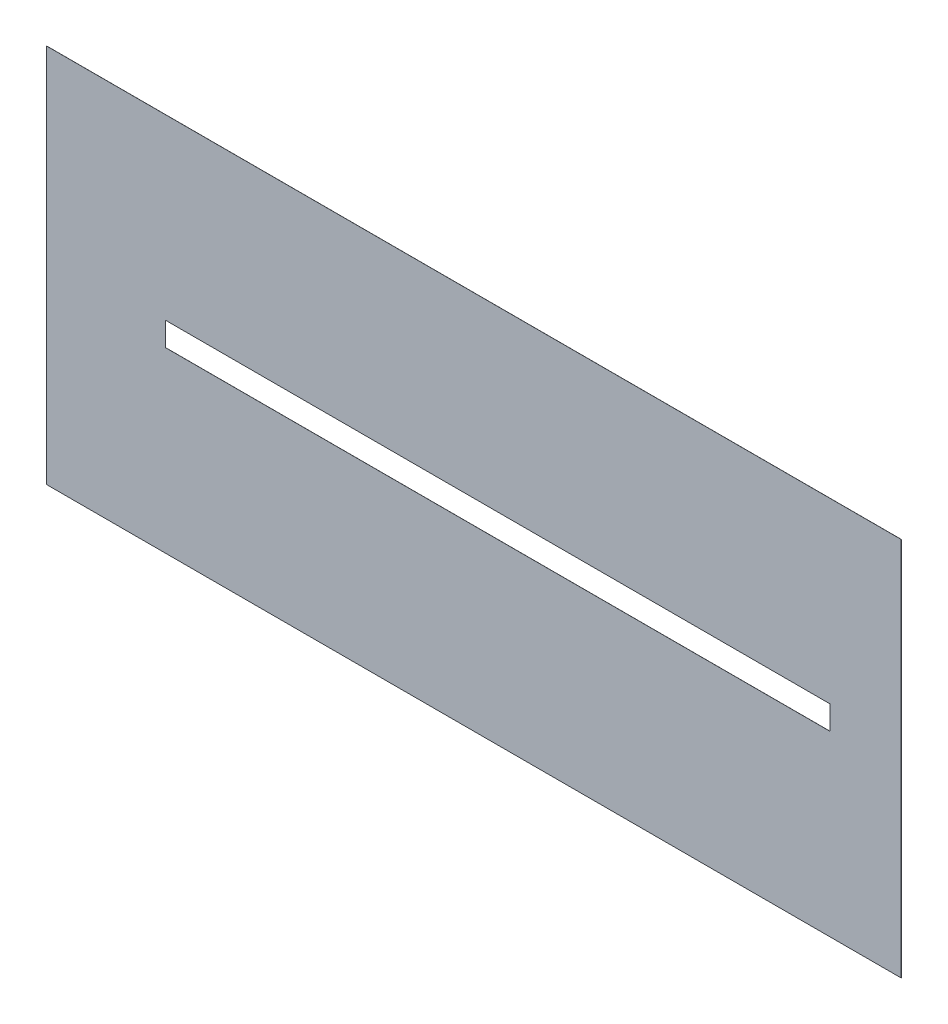
ISO-10303-21;
HEADER;
FILE_DESCRIPTION(('STEP AP214'),'2;1');
FILE_NAME('part.step','',(''),(''),'','','');
FILE_SCHEMA(('AUTOMOTIVE_DESIGN { 1 0 10303 214 1 1 1 1 }'));
ENDSEC;
DATA;
#1=APPLICATION_CONTEXT('core data for automotive mechanical design processes');
#2=APPLICATION_PROTOCOL_DEFINITION('international standard','automotive_design',2000,#1);
#3=PRODUCT_CONTEXT('',#1,'mechanical');
#4=PRODUCT('Part','Part','',(#3));
#5=PRODUCT_RELATED_PRODUCT_CATEGORY('part','',(#4));
#6=PRODUCT_DEFINITION_FORMATION('','',#4);
#7=PRODUCT_DEFINITION_CONTEXT('part definition',#1,'design');
#8=PRODUCT_DEFINITION('design','',#6,#7);
#9=PRODUCT_DEFINITION_SHAPE('','',#8);
#10=(LENGTH_UNIT() NAMED_UNIT(*) SI_UNIT(.MILLI.,.METRE.));
#11=(NAMED_UNIT(*) PLANE_ANGLE_UNIT() SI_UNIT($,.RADIAN.));
#12=(NAMED_UNIT(*) SI_UNIT($,.STERADIAN.) SOLID_ANGLE_UNIT());
#13=UNCERTAINTY_MEASURE_WITH_UNIT(LENGTH_MEASURE(1.E-05),#10,'distance_accuracy_value','');
#14=(GEOMETRIC_REPRESENTATION_CONTEXT(3) GLOBAL_UNCERTAINTY_ASSIGNED_CONTEXT((#13)) GLOBAL_UNIT_ASSIGNED_CONTEXT((#10,
#11,#12)) REPRESENTATION_CONTEXT('',''));
#15=CARTESIAN_POINT('',(0.,0.,0.));
#16=DIRECTION('',(0.,0.,1.));
#17=DIRECTION('',(1.,0.,0.));
#18=AXIS2_PLACEMENT_3D('',#15,#16,#17);
#19=CARTESIAN_POINT('',(-1000.,2000.,-1.));
#20=DIRECTION('',(-1.,0.,0.));
#21=DIRECTION('',(0.,-1.,0.));
#22=AXIS2_PLACEMENT_3D('',#19,#20,#21);
#23=PLANE('',#22);
#24=DIRECTION('',(0.,-1.,0.));
#25=VECTOR('',#24,1.);
#26=CARTESIAN_POINT('',(-1000.,2000.,0.));
#27=LINE('',#26,#25);
#28=CARTESIAN_POINT('',(-1000.,2000.,0.));
#29=VERTEX_POINT('',#28);
#30=CARTESIAN_POINT('',(-1000.,-2000.,0.));
#31=VERTEX_POINT('',#30);
#32=EDGE_CURVE('E152',#29,#31,#27,.T.);
#33=ORIENTED_EDGE('',*,*,#32,.F.);
#34=DIRECTION('',(0.,0.,1.));
#35=VECTOR('',#34,1.);
#36=CARTESIAN_POINT('',(-1000.,2000.,-1.));
#37=LINE('',#36,#35);
#38=CARTESIAN_POINT('',(-1000.,2000.,-1.));
#39=VERTEX_POINT('',#38);
#40=EDGE_CURVE('E11',#39,#29,#37,.T.);
#41=ORIENTED_EDGE('',*,*,#40,.F.);
#42=DIRECTION('',(0.,-1.,0.));
#43=VECTOR('',#42,1.);
#44=CARTESIAN_POINT('',(-1000.,2000.,-1.));
#45=LINE('',#44,#43);
#46=CARTESIAN_POINT('',(-1000.,-2000.,-1.));
#47=VERTEX_POINT('',#46);
#48=EDGE_CURVE('E158',#39,#47,#45,.T.);
#49=ORIENTED_EDGE('',*,*,#48,.T.);
#50=DIRECTION('',(0.,0.,1.));
#51=VECTOR('',#50,1.);
#52=CARTESIAN_POINT('',(-1000.,-2000.,-1.));
#53=LINE('',#52,#51);
#54=EDGE_CURVE('E46',#47,#31,#53,.T.);
#55=ORIENTED_EDGE('',*,*,#54,.T.);
#56=EDGE_LOOP('',(#33,#41,#49,#55));
#57=FACE_BOUND('',#56,.T.);
#58=ADVANCED_FACE('F43',(#57),#23,.T.);
#59=CARTESIAN_POINT('',(-1000.,2000.,-1.));
#60=DIRECTION('',(0.,1.,0.));
#61=DIRECTION('',(0.,0.,1.));
#62=AXIS2_PLACEMENT_3D('',#59,#60,#61);
#63=PLANE('',#62);
#64=DIRECTION('',(-1.,0.,0.));
#65=VECTOR('',#64,1.);
#66=CARTESIAN_POINT('',(-1000.,2000.,0.));
#67=LINE('',#66,#65);
#68=CARTESIAN_POINT('',(8000.,2000.,0.));
#69=VERTEX_POINT('',#68);
#70=EDGE_CURVE('E163',#69,#29,#67,.T.);
#71=ORIENTED_EDGE('',*,*,#70,.F.);
#72=DIRECTION('',(0.,0.,1.));
#73=VECTOR('',#72,1.);
#74=CARTESIAN_POINT('',(8000.,2000.,-1.));
#75=LINE('',#74,#73);
#76=CARTESIAN_POINT('',(8000.,2000.,-1.));
#77=VERTEX_POINT('',#76);
#78=EDGE_CURVE('E52',#77,#69,#75,.T.);
#79=ORIENTED_EDGE('',*,*,#78,.F.);
#80=DIRECTION('',(-1.,0.,0.));
#81=VECTOR('',#80,1.);
#82=CARTESIAN_POINT('',(-1000.,2000.,-1.));
#83=LINE('',#82,#81);
#84=EDGE_CURVE('E171',#77,#39,#83,.T.);
#85=ORIENTED_EDGE('',*,*,#84,.T.);
#86=ORIENTED_EDGE('',*,*,#40,.T.);
#87=EDGE_LOOP('',(#71,#79,#85,#86));
#88=FACE_BOUND('',#87,.T.);
#89=ADVANCED_FACE('F205',(#88),#63,.T.);
#90=CARTESIAN_POINT('',(8000.,2000.,-1.));
#91=DIRECTION('',(1.,0.,0.));
#92=DIRECTION('',(0.,0.,-1.));
#93=AXIS2_PLACEMENT_3D('',#90,#91,#92);
#94=PLANE('',#93);
#95=DIRECTION('',(0.,1.,0.));
#96=VECTOR('',#95,1.);
#97=CARTESIAN_POINT('',(8000.,2000.,0.));
#98=LINE('',#97,#96);
#99=CARTESIAN_POINT('',(8000.,-2000.,0.));
#100=VERTEX_POINT('',#99);
#101=EDGE_CURVE('E182',#100,#69,#98,.T.);
#102=ORIENTED_EDGE('',*,*,#101,.F.);
#103=DIRECTION('',(0.,0.,1.));
#104=VECTOR('',#103,1.);
#105=CARTESIAN_POINT('',(8000.,-2000.,-1.));
#106=LINE('',#105,#104);
#107=CARTESIAN_POINT('',(8000.,-2000.,-1.));
#108=VERTEX_POINT('',#107);
#109=EDGE_CURVE('E190',#108,#100,#106,.T.);
#110=ORIENTED_EDGE('',*,*,#109,.F.);
#111=DIRECTION('',(0.,1.,0.));
#112=VECTOR('',#111,1.);
#113=CARTESIAN_POINT('',(8000.,2000.,-1.));
#114=LINE('',#113,#112);
#115=EDGE_CURVE('E167',#108,#77,#114,.T.);
#116=ORIENTED_EDGE('',*,*,#115,.T.);
#117=ORIENTED_EDGE('',*,*,#78,.T.);
#118=EDGE_LOOP('',(#102,#110,#116,#117));
#119=FACE_BOUND('',#118,.T.);
#120=ADVANCED_FACE('F209',(#119),#94,.T.);
#121=CARTESIAN_POINT('',(-1000.,-2000.,-1.));
#122=DIRECTION('',(0.,-1.,0.));
#123=DIRECTION('',(0.,0.,-1.));
#124=AXIS2_PLACEMENT_3D('',#121,#122,#123);
#125=PLANE('',#124);
#126=DIRECTION('',(1.,0.,0.));
#127=VECTOR('',#126,1.);
#128=CARTESIAN_POINT('',(-1000.,-2000.,0.));
#129=LINE('',#128,#127);
#130=EDGE_CURVE('E178',#31,#100,#129,.T.);
#131=ORIENTED_EDGE('',*,*,#130,.F.);
#132=ORIENTED_EDGE('',*,*,#54,.F.);
#133=DIRECTION('',(1.,0.,0.));
#134=VECTOR('',#133,1.);
#135=CARTESIAN_POINT('',(-1000.,-2000.,-1.));
#136=LINE('',#135,#134);
#137=EDGE_CURVE('E162',#47,#108,#136,.T.);
#138=ORIENTED_EDGE('',*,*,#137,.T.);
#139=ORIENTED_EDGE('',*,*,#109,.T.);
#140=EDGE_LOOP('',(#131,#132,#138,#139));
#141=FACE_BOUND('',#140,.T.);
#142=ADVANCED_FACE('F200',(#141),#125,.T.);
#143=CARTESIAN_POINT('',(0.,0.,-1.));
#144=DIRECTION('',(0.,0.,1.));
#145=DIRECTION('',(1.,0.,0.));
#146=AXIS2_PLACEMENT_3D('',#143,#144,#145);
#147=PLANE('',#146);
#148=DIRECTION('',(-1.,0.,0.));
#149=VECTOR('',#148,1.);
#150=CARTESIAN_POINT('',(250.,125.,-1.));
#151=LINE('',#150,#149);
#152=CARTESIAN_POINT('',(7250.,125.,-1.));
#153=VERTEX_POINT('',#152);
#154=CARTESIAN_POINT('',(250.,125.,-1.));
#155=VERTEX_POINT('',#154);
#156=EDGE_CURVE('E118',#153,#155,#151,.T.);
#157=ORIENTED_EDGE('',*,*,#156,.T.);
#158=DIRECTION('',(0.,-1.,0.));
#159=VECTOR('',#158,1.);
#160=CARTESIAN_POINT('',(250.,125.,-1.));
#161=LINE('',#160,#159);
#162=CARTESIAN_POINT('',(250.,-125.,-1.));
#163=VERTEX_POINT('',#162);
#164=EDGE_CURVE('E111',#155,#163,#161,.T.);
#165=ORIENTED_EDGE('',*,*,#164,.T.);
#166=DIRECTION('',(1.,0.,0.));
#167=VECTOR('',#166,1.);
#168=CARTESIAN_POINT('',(250.,-125.,-1.));
#169=LINE('',#168,#167);
#170=CARTESIAN_POINT('',(7250.,-125.,-1.));
#171=VERTEX_POINT('',#170);
#172=EDGE_CURVE('E121',#163,#171,#169,.T.);
#173=ORIENTED_EDGE('',*,*,#172,.T.);
#174=DIRECTION('',(0.,1.,0.));
#175=VECTOR('',#174,1.);
#176=CARTESIAN_POINT('',(7250.,125.,-1.));
#177=LINE('',#176,#175);
#178=EDGE_CURVE('E60',#171,#153,#177,.T.);
#179=ORIENTED_EDGE('',*,*,#178,.T.);
#180=EDGE_LOOP('',(#157,#165,#173,#179));
#181=FACE_BOUND('',#180,.T.);
#182=ORIENTED_EDGE('',*,*,#48,.F.);
#183=ORIENTED_EDGE('',*,*,#84,.F.);
#184=ORIENTED_EDGE('',*,*,#115,.F.);
#185=ORIENTED_EDGE('',*,*,#137,.F.);
#186=EDGE_LOOP('',(#182,#183,#184,#185));
#187=FACE_BOUND('',#186,.T.);
#188=ADVANCED_FACE('F126',(#181,#187),#147,.F.);
#189=CARTESIAN_POINT('',(0.,0.,0.));
#190=DIRECTION('',(0.,0.,1.));
#191=DIRECTION('',(1.,0.,0.));
#192=AXIS2_PLACEMENT_3D('',#189,#190,#191);
#193=PLANE('',#192);
#194=DIRECTION('',(0.,-1.,0.));
#195=VECTOR('',#194,1.);
#196=CARTESIAN_POINT('',(250.,125.,0.));
#197=LINE('',#196,#195);
#198=CARTESIAN_POINT('',(250.,125.,0.));
#199=VERTEX_POINT('',#198);
#200=CARTESIAN_POINT('',(250.,-125.,0.));
#201=VERTEX_POINT('',#200);
#202=EDGE_CURVE('E68',#199,#201,#197,.T.);
#203=ORIENTED_EDGE('',*,*,#202,.F.);
#204=DIRECTION('',(-1.,0.,0.));
#205=VECTOR('',#204,1.);
#206=CARTESIAN_POINT('',(250.,125.,0.));
#207=LINE('',#206,#205);
#208=CARTESIAN_POINT('',(7250.,125.,0.));
#209=VERTEX_POINT('',#208);
#210=EDGE_CURVE('E130',#209,#199,#207,.T.);
#211=ORIENTED_EDGE('',*,*,#210,.F.);
#212=DIRECTION('',(0.,1.,0.));
#213=VECTOR('',#212,1.);
#214=CARTESIAN_POINT('',(7250.,125.,0.));
#215=LINE('',#214,#213);
#216=CARTESIAN_POINT('',(7250.,-125.,0.));
#217=VERTEX_POINT('',#216);
#218=EDGE_CURVE('E134',#217,#209,#215,.T.);
#219=ORIENTED_EDGE('',*,*,#218,.F.);
#220=DIRECTION('',(1.,0.,0.));
#221=VECTOR('',#220,1.);
#222=CARTESIAN_POINT('',(250.,-125.,0.));
#223=LINE('',#222,#221);
#224=EDGE_CURVE('E143',#201,#217,#223,.T.);
#225=ORIENTED_EDGE('',*,*,#224,.F.);
#226=EDGE_LOOP('',(#203,#211,#219,#225));
#227=FACE_BOUND('',#226,.T.);
#228=ORIENTED_EDGE('',*,*,#32,.T.);
#229=ORIENTED_EDGE('',*,*,#130,.T.);
#230=ORIENTED_EDGE('',*,*,#101,.T.);
#231=ORIENTED_EDGE('',*,*,#70,.T.);
#232=EDGE_LOOP('',(#228,#229,#230,#231));
#233=FACE_BOUND('',#232,.T.);
#234=ADVANCED_FACE('F202',(#227,#233),#193,.T.);
#235=CARTESIAN_POINT('',(250.,125.,-1.));
#236=DIRECTION('',(-1.,0.,0.));
#237=DIRECTION('',(0.,0.,1.));
#238=AXIS2_PLACEMENT_3D('',#235,#236,#237);
#239=PLANE('',#238);
#240=ORIENTED_EDGE('',*,*,#202,.T.);
#241=DIRECTION('',(0.,0.,1.));
#242=VECTOR('',#241,1.);
#243=CARTESIAN_POINT('',(250.,-125.,-1.));
#244=LINE('',#243,#242);
#245=EDGE_CURVE('E107',#163,#201,#244,.T.);
#246=ORIENTED_EDGE('',*,*,#245,.F.);
#247=ORIENTED_EDGE('',*,*,#164,.F.);
#248=DIRECTION('',(0.,0.,1.));
#249=VECTOR('',#248,1.);
#250=CARTESIAN_POINT('',(250.,125.,-1.));
#251=LINE('',#250,#249);
#252=EDGE_CURVE('E149',#155,#199,#251,.T.);
#253=ORIENTED_EDGE('',*,*,#252,.T.);
#254=EDGE_LOOP('',(#240,#246,#247,#253));
#255=FACE_BOUND('',#254,.T.);
#256=ADVANCED_FACE('F109',(#255),#239,.F.);
#257=CARTESIAN_POINT('',(250.,125.,-1.));
#258=DIRECTION('',(0.,1.,0.));
#259=DIRECTION('',(0.,0.,1.));
#260=AXIS2_PLACEMENT_3D('',#257,#258,#259);
#261=PLANE('',#260);
#262=ORIENTED_EDGE('',*,*,#210,.T.);
#263=ORIENTED_EDGE('',*,*,#252,.F.);
#264=ORIENTED_EDGE('',*,*,#156,.F.);
#265=DIRECTION('',(0.,0.,1.));
#266=VECTOR('',#265,1.);
#267=CARTESIAN_POINT('',(7250.,125.,-1.));
#268=LINE('',#267,#266);
#269=EDGE_CURVE('E153',#153,#209,#268,.T.);
#270=ORIENTED_EDGE('',*,*,#269,.T.);
#271=EDGE_LOOP('',(#262,#263,#264,#270));
#272=FACE_BOUND('',#271,.T.);
#273=ADVANCED_FACE('F265',(#272),#261,.F.);
#274=CARTESIAN_POINT('',(7250.,125.,-1.));
#275=DIRECTION('',(1.,0.,0.));
#276=DIRECTION('',(0.,0.,-1.));
#277=AXIS2_PLACEMENT_3D('',#274,#275,#276);
#278=PLANE('',#277);
#279=ORIENTED_EDGE('',*,*,#218,.T.);
#280=ORIENTED_EDGE('',*,*,#269,.F.);
#281=ORIENTED_EDGE('',*,*,#178,.F.);
#282=DIRECTION('',(0.,0.,1.));
#283=VECTOR('',#282,1.);
#284=CARTESIAN_POINT('',(7250.,-125.,-1.));
#285=LINE('',#284,#283);
#286=EDGE_CURVE('E117',#171,#217,#285,.T.);
#287=ORIENTED_EDGE('',*,*,#286,.T.);
#288=EDGE_LOOP('',(#279,#280,#281,#287));
#289=FACE_BOUND('',#288,.T.);
#290=ADVANCED_FACE('F275',(#289),#278,.F.);
#291=CARTESIAN_POINT('',(250.,-125.,-1.));
#292=DIRECTION('',(0.,-1.,0.));
#293=DIRECTION('',(0.,0.,-1.));
#294=AXIS2_PLACEMENT_3D('',#291,#292,#293);
#295=PLANE('',#294);
#296=ORIENTED_EDGE('',*,*,#224,.T.);
#297=ORIENTED_EDGE('',*,*,#286,.F.);
#298=ORIENTED_EDGE('',*,*,#172,.F.);
#299=ORIENTED_EDGE('',*,*,#245,.T.);
#300=EDGE_LOOP('',(#296,#297,#298,#299));
#301=FACE_BOUND('',#300,.T.);
#302=ADVANCED_FACE('F122',(#301),#295,.F.);
#303=CLOSED_SHELL('',(#58,#89,#120,#142,#188,#234,#256,#273,#290,#302));
#304=MANIFOLD_SOLID_BREP('B2',#303);
#305=ADVANCED_BREP_SHAPE_REPRESENTATION('',(#18,#304),#14);
#306=SHAPE_DEFINITION_REPRESENTATION(#9,#305);
ENDSEC;
END-ISO-10303-21;
